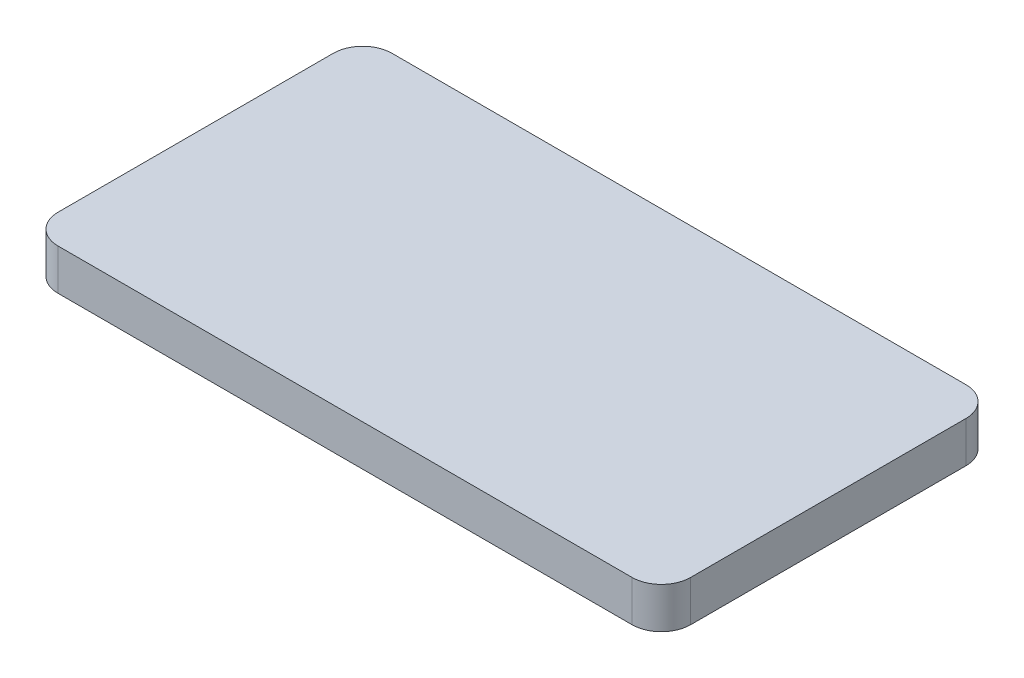
ISO-10303-21;
HEADER;
FILE_DESCRIPTION(('STEP AP214'),'2;1');
FILE_NAME('part.step','',(''),(''),'','','');
FILE_SCHEMA(('AUTOMOTIVE_DESIGN { 1 0 10303 214 1 1 1 1 }'));
ENDSEC;
DATA;
#1=APPLICATION_CONTEXT('core data for automotive mechanical design processes');
#2=APPLICATION_PROTOCOL_DEFINITION('international standard','automotive_design',2000,#1);
#3=PRODUCT_CONTEXT('',#1,'mechanical');
#4=PRODUCT('Part','Part','',(#3));
#5=PRODUCT_RELATED_PRODUCT_CATEGORY('part','',(#4));
#6=PRODUCT_DEFINITION_FORMATION('','',#4);
#7=PRODUCT_DEFINITION_CONTEXT('part definition',#1,'design');
#8=PRODUCT_DEFINITION('design','',#6,#7);
#9=PRODUCT_DEFINITION_SHAPE('','',#8);
#10=(LENGTH_UNIT() NAMED_UNIT(*) SI_UNIT(.MILLI.,.METRE.));
#11=(NAMED_UNIT(*) PLANE_ANGLE_UNIT() SI_UNIT($,.RADIAN.));
#12=(NAMED_UNIT(*) SI_UNIT($,.STERADIAN.) SOLID_ANGLE_UNIT());
#13=UNCERTAINTY_MEASURE_WITH_UNIT(LENGTH_MEASURE(1.E-05),#10,'distance_accuracy_value','');
#14=(GEOMETRIC_REPRESENTATION_CONTEXT(3) GLOBAL_UNCERTAINTY_ASSIGNED_CONTEXT((#13)) GLOBAL_UNIT_ASSIGNED_CONTEXT((#10,
#11,#12)) REPRESENTATION_CONTEXT('',''));
#15=CARTESIAN_POINT('',(0.,0.,0.));
#16=DIRECTION('',(0.,0.,1.));
#17=DIRECTION('',(1.,0.,0.));
#18=AXIS2_PLACEMENT_3D('',#15,#16,#17);
#19=CARTESIAN_POINT('',(49.,7.,-23.5));
#20=DIRECTION('',(0.,-1.,0.));
#21=DIRECTION('',(0.,0.,-1.));
#22=AXIS2_PLACEMENT_3D('',#19,#20,#21);
#23=CYLINDRICAL_SURFACE('',#22,5.);
#24=CARTESIAN_POINT('',(49.,0.,-23.5));
#25=DIRECTION('',(0.,1.,0.));
#26=DIRECTION('',(0.,0.,-1.));
#27=AXIS2_PLACEMENT_3D('',#24,#25,#26);
#28=CIRCLE('',#27,5.);
#29=CARTESIAN_POINT('',(54.,0.,-23.5));
#30=VERTEX_POINT('',#29);
#31=CARTESIAN_POINT('',(49.,0.,-28.5));
#32=VERTEX_POINT('',#31);
#33=EDGE_CURVE('E129',#30,#32,#28,.T.);
#34=ORIENTED_EDGE('',*,*,#33,.T.);
#35=DIRECTION('',(0.,-1.,0.));
#36=VECTOR('',#35,1.);
#37=CARTESIAN_POINT('',(49.,7.,-28.5));
#38=LINE('',#37,#36);
#39=CARTESIAN_POINT('',(49.,7.,-28.5));
#40=VERTEX_POINT('',#39);
#41=EDGE_CURVE('E11',#40,#32,#38,.T.);
#42=ORIENTED_EDGE('',*,*,#41,.F.);
#43=CARTESIAN_POINT('',(49.,7.,-23.5));
#44=DIRECTION('',(0.,1.,0.));
#45=DIRECTION('',(0.,0.,-1.));
#46=AXIS2_PLACEMENT_3D('',#43,#44,#45);
#47=CIRCLE('',#46,5.);
#48=CARTESIAN_POINT('',(54.,7.,-23.5));
#49=VERTEX_POINT('',#48);
#50=EDGE_CURVE('E143',#49,#40,#47,.T.);
#51=ORIENTED_EDGE('',*,*,#50,.F.);
#52=DIRECTION('',(0.,-1.,0.));
#53=VECTOR('',#52,1.);
#54=CARTESIAN_POINT('',(54.,7.,-23.5));
#55=LINE('',#54,#53);
#56=EDGE_CURVE('E125',#49,#30,#55,.T.);
#57=ORIENTED_EDGE('',*,*,#56,.T.);
#58=EDGE_LOOP('',(#34,#42,#51,#57));
#59=FACE_BOUND('',#58,.T.);
#60=ADVANCED_FACE('F33',(#59),#23,.T.);
#61=CARTESIAN_POINT('',(-49.,7.,-28.5));
#62=DIRECTION('',(0.,0.,1.));
#63=DIRECTION('',(1.,0.,0.));
#64=AXIS2_PLACEMENT_3D('',#61,#62,#63);
#65=PLANE('',#64);
#66=DIRECTION('',(-1.,0.,0.));
#67=VECTOR('',#66,1.);
#68=CARTESIAN_POINT('',(-49.,0.,-28.5));
#69=LINE('',#68,#67);
#70=CARTESIAN_POINT('',(-49.,0.,-28.5));
#71=VERTEX_POINT('',#70);
#72=EDGE_CURVE('E132',#32,#71,#69,.T.);
#73=ORIENTED_EDGE('',*,*,#72,.T.);
#74=DIRECTION('',(0.,-1.,0.));
#75=VECTOR('',#74,1.);
#76=CARTESIAN_POINT('',(-49.,7.,-28.5));
#77=LINE('',#76,#75);
#78=CARTESIAN_POINT('',(-49.,7.,-28.5));
#79=VERTEX_POINT('',#78);
#80=EDGE_CURVE('E41',#79,#71,#77,.T.);
#81=ORIENTED_EDGE('',*,*,#80,.F.);
#82=DIRECTION('',(-1.,0.,0.));
#83=VECTOR('',#82,1.);
#84=CARTESIAN_POINT('',(-49.,7.,-28.5));
#85=LINE('',#84,#83);
#86=EDGE_CURVE('E92',#40,#79,#85,.T.);
#87=ORIENTED_EDGE('',*,*,#86,.F.);
#88=ORIENTED_EDGE('',*,*,#41,.T.);
#89=EDGE_LOOP('',(#73,#81,#87,#88));
#90=FACE_BOUND('',#89,.T.);
#91=ADVANCED_FACE('F178',(#90),#65,.F.);
#92=CARTESIAN_POINT('',(-49.,7.,-23.5));
#93=DIRECTION('',(0.,-1.,0.));
#94=DIRECTION('',(0.,0.,-1.));
#95=AXIS2_PLACEMENT_3D('',#92,#93,#94);
#96=CYLINDRICAL_SURFACE('',#95,5.);
#97=CARTESIAN_POINT('',(-49.,0.,-23.5));
#98=DIRECTION('',(0.,1.,0.));
#99=DIRECTION('',(0.,0.,1.));
#100=AXIS2_PLACEMENT_3D('',#97,#98,#99);
#101=CIRCLE('',#100,5.);
#102=CARTESIAN_POINT('',(-54.,0.,-23.5));
#103=VERTEX_POINT('',#102);
#104=EDGE_CURVE('E134',#71,#103,#101,.T.);
#105=ORIENTED_EDGE('',*,*,#104,.T.);
#106=DIRECTION('',(0.,-1.,0.));
#107=VECTOR('',#106,1.);
#108=CARTESIAN_POINT('',(-54.,7.,-23.5));
#109=LINE('',#108,#107);
#110=CARTESIAN_POINT('',(-54.,7.,-23.5));
#111=VERTEX_POINT('',#110);
#112=EDGE_CURVE('E150',#111,#103,#109,.T.);
#113=ORIENTED_EDGE('',*,*,#112,.F.);
#114=CARTESIAN_POINT('',(-49.,7.,-23.5));
#115=DIRECTION('',(0.,1.,0.));
#116=DIRECTION('',(0.,0.,1.));
#117=AXIS2_PLACEMENT_3D('',#114,#115,#116);
#118=CIRCLE('',#117,5.);
#119=EDGE_CURVE('E158',#79,#111,#118,.T.);
#120=ORIENTED_EDGE('',*,*,#119,.F.);
#121=ORIENTED_EDGE('',*,*,#80,.T.);
#122=EDGE_LOOP('',(#105,#113,#120,#121));
#123=FACE_BOUND('',#122,.T.);
#124=ADVANCED_FACE('F156',(#123),#96,.T.);
#125=CARTESIAN_POINT('',(-54.,7.,-23.5));
#126=DIRECTION('',(1.,0.,0.));
#127=DIRECTION('',(0.,0.,-1.));
#128=AXIS2_PLACEMENT_3D('',#125,#126,#127);
#129=PLANE('',#128);
#130=DIRECTION('',(0.,0.,1.));
#131=VECTOR('',#130,1.);
#132=CARTESIAN_POINT('',(-54.,0.,-23.5));
#133=LINE('',#132,#131);
#134=CARTESIAN_POINT('',(-54.,0.,23.5));
#135=VERTEX_POINT('',#134);
#136=EDGE_CURVE('E136',#103,#135,#133,.T.);
#137=ORIENTED_EDGE('',*,*,#136,.T.);
#138=DIRECTION('',(0.,-1.,0.));
#139=VECTOR('',#138,1.);
#140=CARTESIAN_POINT('',(-54.,7.,23.5));
#141=LINE('',#140,#139);
#142=CARTESIAN_POINT('',(-54.,7.,23.5));
#143=VERTEX_POINT('',#142);
#144=EDGE_CURVE('E147',#143,#135,#141,.T.);
#145=ORIENTED_EDGE('',*,*,#144,.F.);
#146=DIRECTION('',(0.,0.,1.));
#147=VECTOR('',#146,1.);
#148=CARTESIAN_POINT('',(-54.,7.,-23.5));
#149=LINE('',#148,#147);
#150=EDGE_CURVE('E170',#111,#143,#149,.T.);
#151=ORIENTED_EDGE('',*,*,#150,.F.);
#152=ORIENTED_EDGE('',*,*,#112,.T.);
#153=EDGE_LOOP('',(#137,#145,#151,#152));
#154=FACE_BOUND('',#153,.T.);
#155=ADVANCED_FACE('F166',(#154),#129,.F.);
#156=CARTESIAN_POINT('',(-49.,7.,23.5));
#157=DIRECTION('',(0.,-1.,0.));
#158=DIRECTION('',(0.,0.,-1.));
#159=AXIS2_PLACEMENT_3D('',#156,#157,#158);
#160=CYLINDRICAL_SURFACE('',#159,5.);
#161=CARTESIAN_POINT('',(-49.,0.,23.5));
#162=DIRECTION('',(0.,1.,0.));
#163=DIRECTION('',(0.,0.,1.));
#164=AXIS2_PLACEMENT_3D('',#161,#162,#163);
#165=CIRCLE('',#164,5.);
#166=CARTESIAN_POINT('',(-49.,0.,28.5));
#167=VERTEX_POINT('',#166);
#168=EDGE_CURVE('E138',#135,#167,#165,.T.);
#169=ORIENTED_EDGE('',*,*,#168,.T.);
#170=DIRECTION('',(0.,-1.,0.));
#171=VECTOR('',#170,1.);
#172=CARTESIAN_POINT('',(-49.,7.,28.5));
#173=LINE('',#172,#171);
#174=CARTESIAN_POINT('',(-49.,7.,28.5));
#175=VERTEX_POINT('',#174);
#176=EDGE_CURVE('E120',#175,#167,#173,.T.);
#177=ORIENTED_EDGE('',*,*,#176,.F.);
#178=CARTESIAN_POINT('',(-49.,7.,23.5));
#179=DIRECTION('',(0.,1.,0.));
#180=DIRECTION('',(0.,0.,1.));
#181=AXIS2_PLACEMENT_3D('',#178,#179,#180);
#182=CIRCLE('',#181,5.);
#183=EDGE_CURVE('E111',#143,#175,#182,.T.);
#184=ORIENTED_EDGE('',*,*,#183,.F.);
#185=ORIENTED_EDGE('',*,*,#144,.T.);
#186=EDGE_LOOP('',(#169,#177,#184,#185));
#187=FACE_BOUND('',#186,.T.);
#188=ADVANCED_FACE('F169',(#187),#160,.T.);
#189=CARTESIAN_POINT('',(-49.,7.,28.5));
#190=DIRECTION('',(0.,0.,-1.));
#191=DIRECTION('',(-1.,0.,0.));
#192=AXIS2_PLACEMENT_3D('',#189,#190,#191);
#193=PLANE('',#192);
#194=DIRECTION('',(1.,0.,0.));
#195=VECTOR('',#194,1.);
#196=CARTESIAN_POINT('',(-49.,0.,28.5));
#197=LINE('',#196,#195);
#198=CARTESIAN_POINT('',(49.,0.,28.5));
#199=VERTEX_POINT('',#198);
#200=EDGE_CURVE('E119',#167,#199,#197,.T.);
#201=ORIENTED_EDGE('',*,*,#200,.T.);
#202=DIRECTION('',(0.,-1.,0.));
#203=VECTOR('',#202,1.);
#204=CARTESIAN_POINT('',(49.,7.,28.5));
#205=LINE('',#204,#203);
#206=CARTESIAN_POINT('',(49.,7.,28.5));
#207=VERTEX_POINT('',#206);
#208=EDGE_CURVE('E116',#207,#199,#205,.T.);
#209=ORIENTED_EDGE('',*,*,#208,.F.);
#210=DIRECTION('',(1.,0.,0.));
#211=VECTOR('',#210,1.);
#212=CARTESIAN_POINT('',(-49.,7.,28.5));
#213=LINE('',#212,#211);
#214=EDGE_CURVE('E105',#175,#207,#213,.T.);
#215=ORIENTED_EDGE('',*,*,#214,.F.);
#216=ORIENTED_EDGE('',*,*,#176,.T.);
#217=EDGE_LOOP('',(#201,#209,#215,#216));
#218=FACE_BOUND('',#217,.T.);
#219=ADVANCED_FACE('F117',(#218),#193,.F.);
#220=CARTESIAN_POINT('',(49.,7.,23.5));
#221=DIRECTION('',(0.,-1.,0.));
#222=DIRECTION('',(0.,0.,-1.));
#223=AXIS2_PLACEMENT_3D('',#220,#221,#222);
#224=CYLINDRICAL_SURFACE('',#223,5.);
#225=CARTESIAN_POINT('',(49.,0.,23.5));
#226=DIRECTION('',(0.,1.,0.));
#227=DIRECTION('',(0.,0.,1.));
#228=AXIS2_PLACEMENT_3D('',#225,#226,#227);
#229=CIRCLE('',#228,5.);
#230=CARTESIAN_POINT('',(54.,0.,23.5));
#231=VERTEX_POINT('',#230);
#232=EDGE_CURVE('E78',#199,#231,#229,.T.);
#233=ORIENTED_EDGE('',*,*,#232,.T.);
#234=DIRECTION('',(0.,-1.,0.));
#235=VECTOR('',#234,1.);
#236=CARTESIAN_POINT('',(54.,7.,23.5));
#237=LINE('',#236,#235);
#238=CARTESIAN_POINT('',(54.,7.,23.5));
#239=VERTEX_POINT('',#238);
#240=EDGE_CURVE('E121',#239,#231,#237,.T.);
#241=ORIENTED_EDGE('',*,*,#240,.F.);
#242=CARTESIAN_POINT('',(49.,7.,23.5));
#243=DIRECTION('',(0.,1.,0.));
#244=DIRECTION('',(0.,0.,1.));
#245=AXIS2_PLACEMENT_3D('',#242,#243,#244);
#246=CIRCLE('',#245,5.);
#247=EDGE_CURVE('E109',#207,#239,#246,.T.);
#248=ORIENTED_EDGE('',*,*,#247,.F.);
#249=ORIENTED_EDGE('',*,*,#208,.T.);
#250=EDGE_LOOP('',(#233,#241,#248,#249));
#251=FACE_BOUND('',#250,.T.);
#252=ADVANCED_FACE('F123',(#251),#224,.T.);
#253=CARTESIAN_POINT('',(54.,7.,-23.5));
#254=DIRECTION('',(-1.,0.,0.));
#255=DIRECTION('',(0.,0.,1.));
#256=AXIS2_PLACEMENT_3D('',#253,#254,#255);
#257=PLANE('',#256);
#258=DIRECTION('',(0.,0.,-1.));
#259=VECTOR('',#258,1.);
#260=CARTESIAN_POINT('',(54.,0.,-23.5));
#261=LINE('',#260,#259);
#262=EDGE_CURVE('E84',#231,#30,#261,.T.);
#263=ORIENTED_EDGE('',*,*,#262,.T.);
#264=ORIENTED_EDGE('',*,*,#56,.F.);
#265=DIRECTION('',(0.,0.,-1.));
#266=VECTOR('',#265,1.);
#267=CARTESIAN_POINT('',(54.,7.,-23.5));
#268=LINE('',#267,#266);
#269=EDGE_CURVE('E49',#239,#49,#268,.T.);
#270=ORIENTED_EDGE('',*,*,#269,.F.);
#271=ORIENTED_EDGE('',*,*,#240,.T.);
#272=EDGE_LOOP('',(#263,#264,#270,#271));
#273=FACE_BOUND('',#272,.T.);
#274=ADVANCED_FACE('F194',(#273),#257,.F.);
#275=CARTESIAN_POINT('',(49.,7.,-23.5));
#276=DIRECTION('',(0.,-1.,0.));
#277=DIRECTION('',(0.,0.,-1.));
#278=AXIS2_PLACEMENT_3D('',#275,#276,#277);
#279=PLANE('',#278);
#280=ORIENTED_EDGE('',*,*,#50,.T.);
#281=ORIENTED_EDGE('',*,*,#86,.T.);
#282=ORIENTED_EDGE('',*,*,#119,.T.);
#283=ORIENTED_EDGE('',*,*,#150,.T.);
#284=ORIENTED_EDGE('',*,*,#183,.T.);
#285=ORIENTED_EDGE('',*,*,#214,.T.);
#286=ORIENTED_EDGE('',*,*,#247,.T.);
#287=ORIENTED_EDGE('',*,*,#269,.T.);
#288=EDGE_LOOP('',(#280,#281,#282,#283,#284,#285,#286,#287));
#289=FACE_BOUND('',#288,.T.);
#290=ADVANCED_FACE('F107',(#289),#279,.F.);
#291=CARTESIAN_POINT('',(49.,0.,-23.5));
#292=DIRECTION('',(0.,-1.,0.));
#293=DIRECTION('',(0.,0.,-1.));
#294=AXIS2_PLACEMENT_3D('',#291,#292,#293);
#295=PLANE('',#294);
#296=ORIENTED_EDGE('',*,*,#33,.F.);
#297=ORIENTED_EDGE('',*,*,#262,.F.);
#298=ORIENTED_EDGE('',*,*,#232,.F.);
#299=ORIENTED_EDGE('',*,*,#200,.F.);
#300=ORIENTED_EDGE('',*,*,#168,.F.);
#301=ORIENTED_EDGE('',*,*,#136,.F.);
#302=ORIENTED_EDGE('',*,*,#104,.F.);
#303=ORIENTED_EDGE('',*,*,#72,.F.);
#304=EDGE_LOOP('',(#296,#297,#298,#299,#300,#301,#302,#303));
#305=FACE_BOUND('',#304,.T.);
#306=ADVANCED_FACE('F162',(#305),#295,.T.);
#307=CLOSED_SHELL('',(#60,#91,#124,#155,#188,#219,#252,#274,#290,#306));
#308=MANIFOLD_SOLID_BREP('B2',#307);
#309=ADVANCED_BREP_SHAPE_REPRESENTATION('',(#18,#308),#14);
#310=SHAPE_DEFINITION_REPRESENTATION(#9,#309);
ENDSEC;
END-ISO-10303-21;
